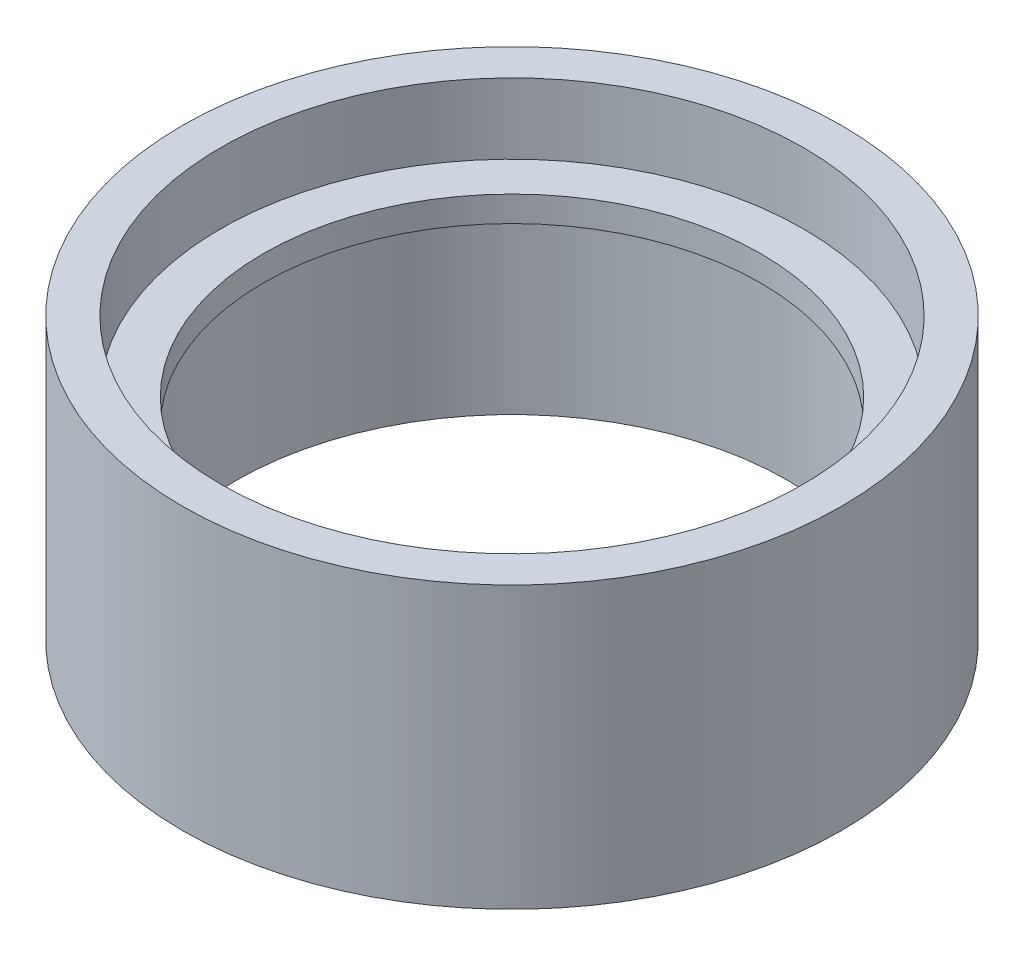
ISO-10303-21;
HEADER;
FILE_DESCRIPTION(('STEP AP214'),'2;1');
FILE_NAME('part.step','',(''),(''),'','','');
FILE_SCHEMA(('AUTOMOTIVE_DESIGN { 1 0 10303 214 1 1 1 1 }'));
ENDSEC;
DATA;
#1=APPLICATION_CONTEXT('core data for automotive mechanical design processes');
#2=APPLICATION_PROTOCOL_DEFINITION('international standard','automotive_design',2000,#1);
#3=PRODUCT_CONTEXT('',#1,'mechanical');
#4=PRODUCT('Part','Part','',(#3));
#5=PRODUCT_RELATED_PRODUCT_CATEGORY('part','',(#4));
#6=PRODUCT_DEFINITION_FORMATION('','',#4);
#7=PRODUCT_DEFINITION_CONTEXT('part definition',#1,'design');
#8=PRODUCT_DEFINITION('design','',#6,#7);
#9=PRODUCT_DEFINITION_SHAPE('','',#8);
#10=(LENGTH_UNIT() NAMED_UNIT(*) SI_UNIT(.MILLI.,.METRE.));
#11=(NAMED_UNIT(*) PLANE_ANGLE_UNIT() SI_UNIT($,.RADIAN.));
#12=(NAMED_UNIT(*) SI_UNIT($,.STERADIAN.) SOLID_ANGLE_UNIT());
#13=UNCERTAINTY_MEASURE_WITH_UNIT(LENGTH_MEASURE(1.E-05),#10,'distance_accuracy_value','');
#14=(GEOMETRIC_REPRESENTATION_CONTEXT(3) GLOBAL_UNCERTAINTY_ASSIGNED_CONTEXT((#13)) GLOBAL_UNIT_ASSIGNED_CONTEXT((#10,
#11,#12)) REPRESENTATION_CONTEXT('',''));
#15=CARTESIAN_POINT('',(0.,0.,0.));
#16=DIRECTION('',(0.,0.,1.));
#17=DIRECTION('',(1.,0.,0.));
#18=AXIS2_PLACEMENT_3D('',#15,#16,#17);
#19=CARTESIAN_POINT('',(0.,0.,0.));
#20=DIRECTION('',(0.,1.,0.));
#21=DIRECTION('',(0.,0.,1.));
#22=AXIS2_PLACEMENT_3D('',#19,#20,#21);
#23=PLANE('',#22);
#24=CARTESIAN_POINT('',(0.,0.,0.));
#25=DIRECTION('',(0.,1.,0.));
#26=DIRECTION('',(0.,0.,1.));
#27=AXIS2_PLACEMENT_3D('',#24,#25,#26);
#28=CIRCLE('',#27,24.765);
#29=CARTESIAN_POINT('',(0.,0.,24.765));
#30=VERTEX_POINT('',#29);
#31=EDGE_CURVE('E48',#30,#30,#28,.T.);
#32=ORIENTED_EDGE('',*,*,#31,.T.);
#33=EDGE_LOOP('',(#32));
#34=FACE_BOUND('',#33,.T.);
#35=CARTESIAN_POINT('',(0.,0.,0.));
#36=DIRECTION('',(0.,-1.,0.));
#37=DIRECTION('',(0.,0.,-1.));
#38=AXIS2_PLACEMENT_3D('',#35,#36,#37);
#39=CIRCLE('',#38,27.5082);
#40=CARTESIAN_POINT('',(0.,0.,-27.5082));
#41=VERTEX_POINT('',#40);
#42=EDGE_CURVE('E75',#41,#41,#39,.T.);
#43=ORIENTED_EDGE('',*,*,#42,.T.);
#44=EDGE_LOOP('',(#43));
#45=FACE_BOUND('',#44,.T.);
#46=ADVANCED_FACE('F45',(#34,#45),#23,.F.);
#47=CARTESIAN_POINT('',(0.,2.54,0.));
#48=DIRECTION('',(0.,1.,0.));
#49=DIRECTION('',(0.,0.,1.));
#50=AXIS2_PLACEMENT_3D('',#47,#48,#49);
#51=PLANE('',#50);
#52=CARTESIAN_POINT('',(0.,2.54,0.));
#53=DIRECTION('',(0.,1.,0.));
#54=DIRECTION('',(0.,0.,1.));
#55=AXIS2_PLACEMENT_3D('',#52,#53,#54);
#56=CIRCLE('',#55,29.0195);
#57=CARTESIAN_POINT('',(0.,2.53999999999999,-29.0195));
#58=VERTEX_POINT('',#57);
#59=EDGE_CURVE('E57',#58,#58,#56,.F.);
#60=ORIENTED_EDGE('',*,*,#59,.F.);
#61=EDGE_LOOP('',(#60));
#62=FACE_BOUND('',#61,.T.);
#63=CARTESIAN_POINT('',(0.,2.54,0.));
#64=DIRECTION('',(0.,1.,0.));
#65=DIRECTION('',(0.,0.,1.));
#66=AXIS2_PLACEMENT_3D('',#63,#64,#65);
#67=CIRCLE('',#66,24.765);
#68=CARTESIAN_POINT('',(0.,2.54,24.765));
#69=VERTEX_POINT('',#68);
#70=EDGE_CURVE('E11',#69,#69,#67,.T.);
#71=ORIENTED_EDGE('',*,*,#70,.F.);
#72=EDGE_LOOP('',(#71));
#73=FACE_BOUND('',#72,.T.);
#74=ADVANCED_FACE('F101',(#62,#73),#51,.T.);
#75=CARTESIAN_POINT('',(0.,2.54,0.));
#76=DIRECTION('',(0.,-1.,0.));
#77=DIRECTION('',(0.,0.,-1.));
#78=AXIS2_PLACEMENT_3D('',#75,#76,#77);
#79=CYLINDRICAL_SURFACE('',#78,24.765);
#80=ORIENTED_EDGE('',*,*,#70,.T.);
#81=EDGE_LOOP('',(#80));
#82=FACE_BOUND('',#81,.T.);
#83=ORIENTED_EDGE('',*,*,#31,.F.);
#84=EDGE_LOOP('',(#83));
#85=FACE_BOUND('',#84,.T.);
#86=ADVANCED_FACE('F106',(#82,#85),#79,.F.);
#87=CARTESIAN_POINT('',(0.,109.416648291855,0.));
#88=DIRECTION('',(0.,-1.,0.));
#89=DIRECTION('',(0.,0.,-1.));
#90=AXIS2_PLACEMENT_3D('',#87,#88,#89);
#91=CYLINDRICAL_SURFACE('',#90,32.8295);
#92=CARTESIAN_POINT('',(0.,9.5504,0.));
#93=DIRECTION('',(0.,1.,0.));
#94=DIRECTION('',(0.,0.,1.));
#95=AXIS2_PLACEMENT_3D('',#92,#93,#94);
#96=CIRCLE('',#95,32.8295);
#97=CARTESIAN_POINT('',(0.,9.55039999999999,-32.8295));
#98=VERTEX_POINT('',#97);
#99=EDGE_CURVE('E62',#98,#98,#96,.T.);
#100=CARTESIAN_POINT('',(0.,-18.415,0.));
#101=DIRECTION('',(0.,-1.,0.));
#102=DIRECTION('',(0.,0.,-1.));
#103=AXIS2_PLACEMENT_3D('',#100,#101,#102);
#104=CIRCLE('',#103,32.8295);
#105=CARTESIAN_POINT('',(0.,-18.415,-32.8295));
#106=VERTEX_POINT('',#105);
#107=EDGE_CURVE('E67',#106,#106,#104,.T.);
#108=CARTESIAN_POINT('',(0.,9.55039999999999,-32.8295));
#109=CARTESIAN_POINT('',(0.,9.25909374999999,-32.8295));
#110=CARTESIAN_POINT('',(0.,8.96778749999999,-32.8295));
#111=CARTESIAN_POINT('',(0.,8.38517499999999,-32.8295));
#112=CARTESIAN_POINT('',(0.,8.09386874999999,-32.8295));
#113=CARTESIAN_POINT('',(0.,7.51125624999999,-32.8295));
#114=CARTESIAN_POINT('',(0.,7.21994999999999,-32.8295));
#115=CARTESIAN_POINT('',(0.,6.63733749999999,-32.8295));
#116=CARTESIAN_POINT('',(0.,6.34603124999999,-32.8295));
#117=CARTESIAN_POINT('',(0.,5.76341874999999,-32.8295));
#118=CARTESIAN_POINT('',(0.,5.47211249999999,-32.8295));
#119=CARTESIAN_POINT('',(0.,4.88949999999999,-32.8295));
#120=CARTESIAN_POINT('',(0.,4.59819374999998,-32.8295));
#121=CARTESIAN_POINT('',(0.,4.01558124999998,-32.8295));
#122=CARTESIAN_POINT('',(0.,3.72427499999999,-32.8295));
#123=CARTESIAN_POINT('',(0.,3.14166249999998,-32.8295));
#124=CARTESIAN_POINT('',(0.,2.85035624999998,-32.8295));
#125=CARTESIAN_POINT('',(0.,2.26774374999998,-32.8295));
#126=CARTESIAN_POINT('',(0.,1.97643749999998,-32.8295));
#127=CARTESIAN_POINT('',(0.,1.39382499999999,-32.8295));
#128=CARTESIAN_POINT('',(0.,1.10251874999999,-32.8295));
#129=CARTESIAN_POINT('',(0.,0.519906249999989,-32.8295));
#130=CARTESIAN_POINT('',(0.,0.228599999999986,-32.8295));
#131=CARTESIAN_POINT('',(0.,-0.354012500000014,-32.8295));
#132=CARTESIAN_POINT('',(0.,-0.645318750000012,-32.8295));
#133=CARTESIAN_POINT('',(0.,-1.22793125000001,-32.8295));
#134=CARTESIAN_POINT('',(0.,-1.51923750000002,-32.8295));
#135=CARTESIAN_POINT('',(0.,-2.10185000000002,-32.8295));
#136=CARTESIAN_POINT('',(0.,-2.39315625000001,-32.8295));
#137=CARTESIAN_POINT('',(0.,-2.97576875000001,-32.8295));
#138=CARTESIAN_POINT('',(0.,-3.26707500000002,-32.8295));
#139=CARTESIAN_POINT('',(0.,-3.84968750000002,-32.8295));
#140=CARTESIAN_POINT('',(0.,-4.14099375000002,-32.8295));
#141=CARTESIAN_POINT('',(0.,-4.72360625000001,-32.8295));
#142=CARTESIAN_POINT('',(0.,-5.01491250000001,-32.8295));
#143=CARTESIAN_POINT('',(0.,-5.59752500000001,-32.8295));
#144=CARTESIAN_POINT('',(0.,-5.88883125000001,-32.8295));
#145=CARTESIAN_POINT('',(0.,-6.47144375000001,-32.8295));
#146=CARTESIAN_POINT('',(0.,-6.76275000000001,-32.8295));
#147=CARTESIAN_POINT('',(0.,-7.34536250000001,-32.8295));
#148=CARTESIAN_POINT('',(0.,-7.63666875000002,-32.8295));
#149=CARTESIAN_POINT('',(0.,-8.21928125000002,-32.8295));
#150=CARTESIAN_POINT('',(0.,-8.51058750000001,-32.8295));
#151=CARTESIAN_POINT('',(0.,-9.09320000000002,-32.8295));
#152=CARTESIAN_POINT('',(0.,-9.38450625000002,-32.8295));
#153=CARTESIAN_POINT('',(0.,-9.96711875000002,-32.8295));
#154=CARTESIAN_POINT('',(0.,-10.258425,-32.8295));
#155=CARTESIAN_POINT('',(0.,-10.8410375,-32.8295));
#156=CARTESIAN_POINT('',(0.,-11.13234375,-32.8295));
#157=CARTESIAN_POINT('',(0.,-11.71495625,-32.8295));
#158=CARTESIAN_POINT('',(0.,-12.0062625,-32.8295));
#159=CARTESIAN_POINT('',(0.,-12.588875,-32.8295));
#160=CARTESIAN_POINT('',(0.,-12.88018125,-32.8295));
#161=CARTESIAN_POINT('',(0.,-13.46279375,-32.8295));
#162=CARTESIAN_POINT('',(0.,-13.7541,-32.8295));
#163=CARTESIAN_POINT('',(0.,-14.3367125,-32.8295));
#164=CARTESIAN_POINT('',(0.,-14.62801875,-32.8295));
#165=CARTESIAN_POINT('',(0.,-15.21063125,-32.8295));
#166=CARTESIAN_POINT('',(0.,-15.5019375,-32.8295));
#167=CARTESIAN_POINT('',(0.,-16.08455,-32.8295));
#168=CARTESIAN_POINT('',(0.,-16.37585625,-32.8295));
#169=CARTESIAN_POINT('',(0.,-16.95846875,-32.8295));
#170=CARTESIAN_POINT('',(0.,-17.249775,-32.8295));
#171=CARTESIAN_POINT('',(0.,-17.8323875,-32.8295));
#172=CARTESIAN_POINT('',(0.,-18.12369375,-32.8295));
#173=CARTESIAN_POINT('',(0.,-18.415,-32.8295));
#174=B_SPLINE_CURVE_WITH_KNOTS('',3,(#108,#109,#110,#111,#112,#113,#114,#115,#116,#117,#118,
#119,#120,#121,#122,#123,#124,#125,#126,#127,#128,#129,#130,#131,#132,#133,#134,#135,#136,#137,
#138,#139,#140,#141,#142,#143,#144,#145,#146,#147,#148,#149,#150,#151,#152,#153,#154,#155,#156,
#157,#158,#159,#160,#161,#162,#163,#164,#165,#166,#167,#168,#169,#170,#171,#172,#173),
.UNSPECIFIED.,.F.,.F.,(4,2,2,2,2,2,2,2,2,2,2,2,2,2,2,2,2,2,2,2,2,2,2,2,2,2,2,2,2,2,2,2,4),(0.,
0.873918749999994,1.7478375,2.62175625,3.495675,4.36959375,5.24351250000001,6.11743125,
6.99135000000001,7.86526875,8.73918749999999,9.61310625,10.487025,11.36094375,12.2348625,
13.10878125,13.9827,14.85661875,15.7305375,16.60445625,17.478375,18.35229375,19.2262125,
20.10013125,20.97405,21.84796875,22.7218875,23.59580625,24.469725,25.34364375,26.2175625,
27.09148125,27.9654),.UNSPECIFIED.);
#175=EDGE_CURVE('BSEAM113',#98,#106,#174,.T.);
#176=ORIENTED_EDGE('',*,*,#99,.F.);
#177=ORIENTED_EDGE('',*,*,#107,.F.);
#178=ORIENTED_EDGE('',*,*,#175,.T.);
#179=ORIENTED_EDGE('',*,*,#175,.F.);
#180=EDGE_LOOP('',(#176,#178,#177,#179));
#181=FACE_BOUND('',#180,.T.);
#182=ADVANCED_FACE('F113',(#181),#91,.T.);
#183=CARTESIAN_POINT('',(0.,109.416648291855,0.));
#184=DIRECTION('',(0.,-1.,0.));
#185=DIRECTION('',(0.,0.,-1.));
#186=AXIS2_PLACEMENT_3D('',#183,#184,#185);
#187=CYLINDRICAL_SURFACE('',#186,29.0195);
#188=CARTESIAN_POINT('',(0.,9.5504,0.));
#189=DIRECTION('',(0.,1.,0.));
#190=DIRECTION('',(0.,0.,1.));
#191=AXIS2_PLACEMENT_3D('',#188,#189,#190);
#192=CIRCLE('',#191,29.0195);
#193=CARTESIAN_POINT('',(0.,9.55039999999999,-29.0195));
#194=VERTEX_POINT('',#193);
#195=EDGE_CURVE('E63',#194,#194,#192,.T.);
#196=CARTESIAN_POINT('',(0.,2.53999999999999,-29.0195));
#197=CARTESIAN_POINT('',(0.,2.61302499999999,-29.0195));
#198=CARTESIAN_POINT('',(0.,2.68604999999999,-29.0195));
#199=CARTESIAN_POINT('',(0.,2.83209999999999,-29.0195));
#200=CARTESIAN_POINT('',(0.,2.90512499999999,-29.0195));
#201=CARTESIAN_POINT('',(0.,3.05117499999998,-29.0195));
#202=CARTESIAN_POINT('',(0.,3.12419999999998,-29.0195));
#203=CARTESIAN_POINT('',(0.,3.27024999999998,-29.0195));
#204=CARTESIAN_POINT('',(0.,3.34327499999998,-29.0195));
#205=CARTESIAN_POINT('',(0.,3.48932499999998,-29.0195));
#206=CARTESIAN_POINT('',(0.,3.56234999999998,-29.0195));
#207=CARTESIAN_POINT('',(0.,3.70839999999998,-29.0195));
#208=CARTESIAN_POINT('',(0.,3.78142499999998,-29.0195));
#209=CARTESIAN_POINT('',(0.,3.92747499999998,-29.0195));
#210=CARTESIAN_POINT('',(0.,4.00049999999998,-29.0195));
#211=CARTESIAN_POINT('',(0.,4.14654999999998,-29.0195));
#212=CARTESIAN_POINT('',(0.,4.21957499999998,-29.0195));
#213=CARTESIAN_POINT('',(0.,4.36562499999998,-29.0195));
#214=CARTESIAN_POINT('',(0.,4.43864999999999,-29.0195));
#215=CARTESIAN_POINT('',(0.,4.58469999999999,-29.0195));
#216=CARTESIAN_POINT('',(0.,4.65772499999999,-29.0195));
#217=CARTESIAN_POINT('',(0.,4.80377499999999,-29.0195));
#218=CARTESIAN_POINT('',(0.,4.87679999999999,-29.0195));
#219=CARTESIAN_POINT('',(0.,5.02284999999999,-29.0195));
#220=CARTESIAN_POINT('',(0.,5.09587499999999,-29.0195));
#221=CARTESIAN_POINT('',(0.,5.24192499999999,-29.0195));
#222=CARTESIAN_POINT('',(0.,5.31494999999999,-29.0195));
#223=CARTESIAN_POINT('',(0.,5.46099999999999,-29.0195));
#224=CARTESIAN_POINT('',(0.,5.53402499999999,-29.0195));
#225=CARTESIAN_POINT('',(0.,5.68007499999999,-29.0195));
#226=CARTESIAN_POINT('',(0.,5.75309999999999,-29.0195));
#227=CARTESIAN_POINT('',(0.,5.89914999999999,-29.0195));
#228=CARTESIAN_POINT('',(0.,5.97217499999999,-29.0195));
#229=CARTESIAN_POINT('',(0.,6.11822499999999,-29.0195));
#230=CARTESIAN_POINT('',(0.,6.19124999999999,-29.0195));
#231=CARTESIAN_POINT('',(0.,6.33729999999999,-29.0195));
#232=CARTESIAN_POINT('',(0.,6.41032499999999,-29.0195));
#233=CARTESIAN_POINT('',(0.,6.55637499999998,-29.0195));
#234=CARTESIAN_POINT('',(0.,6.62939999999998,-29.0195));
#235=CARTESIAN_POINT('',(0.,6.77544999999998,-29.0195));
#236=CARTESIAN_POINT('',(0.,6.84847499999998,-29.0195));
#237=CARTESIAN_POINT('',(0.,6.99452499999998,-29.0195));
#238=CARTESIAN_POINT('',(0.,7.06754999999998,-29.0195));
#239=CARTESIAN_POINT('',(0.,7.21359999999998,-29.0195));
#240=CARTESIAN_POINT('',(0.,7.28662499999998,-29.0195));
#241=CARTESIAN_POINT('',(0.,7.43267499999998,-29.0195));
#242=CARTESIAN_POINT('',(0.,7.50569999999998,-29.0195));
#243=CARTESIAN_POINT('',(0.,7.65174999999998,-29.0195));
#244=CARTESIAN_POINT('',(0.,7.72477499999999,-29.0195));
#245=CARTESIAN_POINT('',(0.,7.87082499999999,-29.0195));
#246=CARTESIAN_POINT('',(0.,7.94384999999999,-29.0195));
#247=CARTESIAN_POINT('',(0.,8.08989999999999,-29.0195));
#248=CARTESIAN_POINT('',(0.,8.16292499999999,-29.0195));
#249=CARTESIAN_POINT('',(0.,8.30897499999999,-29.0195));
#250=CARTESIAN_POINT('',(0.,8.38199999999999,-29.0195));
#251=CARTESIAN_POINT('',(0.,8.52804999999999,-29.0195));
#252=CARTESIAN_POINT('',(0.,8.60107499999999,-29.0195));
#253=CARTESIAN_POINT('',(0.,8.74712499999999,-29.0195));
#254=CARTESIAN_POINT('',(0.,8.82014999999999,-29.0195));
#255=CARTESIAN_POINT('',(0.,8.96619999999999,-29.0195));
#256=CARTESIAN_POINT('',(0.,9.03922499999999,-29.0195));
#257=CARTESIAN_POINT('',(0.,9.18527499999999,-29.0195));
#258=CARTESIAN_POINT('',(0.,9.25829999999999,-29.0195));
#259=CARTESIAN_POINT('',(0.,9.40434999999999,-29.0195));
#260=CARTESIAN_POINT('',(0.,9.47737499999999,-29.0195));
#261=CARTESIAN_POINT('',(0.,9.55039999999999,-29.0195));
#262=B_SPLINE_CURVE_WITH_KNOTS('',3,(#196,#197,#198,#199,#200,#201,#202,#203,#204,#205,#206,
#207,#208,#209,#210,#211,#212,#213,#214,#215,#216,#217,#218,#219,#220,#221,#222,#223,#224,#225,
#226,#227,#228,#229,#230,#231,#232,#233,#234,#235,#236,#237,#238,#239,#240,#241,#242,#243,#244,
#245,#246,#247,#248,#249,#250,#251,#252,#253,#254,#255,#256,#257,#258,#259,#260,#261),
.UNSPECIFIED.,.F.,.F.,(4,2,2,2,2,2,2,2,2,2,2,2,2,2,2,2,2,2,2,2,2,2,2,2,2,2,2,2,2,2,2,2,4),(0.,
0.219074999999999,0.438149999999998,0.657224999999997,0.876299999999997,1.095375,
1.31444999999999,1.53352499999999,1.75259999999999,1.97167500000001,2.19075000000001,2.409825,
2.6289,2.847975,3.06705,3.286125,3.5052,3.724275,3.94335,4.162425,4.3815,4.600575,
4.81964999999999,5.03872499999999,5.25780000000001,5.47687500000001,5.69595000000001,5.915025,
6.1341,6.353175,6.57225,6.791325,7.0104),.UNSPECIFIED.);
#263=EDGE_CURVE('BSEAM97',#58,#194,#262,.T.);
#264=ORIENTED_EDGE('',*,*,#59,.T.);
#265=ORIENTED_EDGE('',*,*,#195,.T.);
#266=ORIENTED_EDGE('',*,*,#263,.T.);
#267=ORIENTED_EDGE('',*,*,#263,.F.);
#268=EDGE_LOOP('',(#264,#266,#265,#267));
#269=FACE_BOUND('',#268,.T.);
#270=ADVANCED_FACE('F97',(#269),#187,.F.);
#271=CARTESIAN_POINT('',(0.,9.5504,0.));
#272=DIRECTION('',(0.,1.,0.));
#273=DIRECTION('',(0.,0.,1.));
#274=AXIS2_PLACEMENT_3D('',#271,#272,#273);
#275=PLANE('',#274);
#276=ORIENTED_EDGE('',*,*,#195,.F.);
#277=EDGE_LOOP('',(#276));
#278=FACE_BOUND('',#277,.T.);
#279=ORIENTED_EDGE('',*,*,#99,.T.);
#280=EDGE_LOOP('',(#279));
#281=FACE_BOUND('',#280,.T.);
#282=ADVANCED_FACE('F88',(#278,#281),#275,.T.);
#283=CARTESIAN_POINT('',(0.,-18.415,0.));
#284=DIRECTION('',(0.,-1.,0.));
#285=DIRECTION('',(0.,0.,-1.));
#286=AXIS2_PLACEMENT_3D('',#283,#284,#285);
#287=PLANE('',#286);
#288=ORIENTED_EDGE('',*,*,#107,.T.);
#289=EDGE_LOOP('',(#288));
#290=FACE_BOUND('',#289,.T.);
#291=CARTESIAN_POINT('',(0.,-18.415,0.));
#292=DIRECTION('',(0.,-1.,0.));
#293=DIRECTION('',(0.,0.,-1.));
#294=AXIS2_PLACEMENT_3D('',#291,#292,#293);
#295=CIRCLE('',#294,27.5082);
#296=CARTESIAN_POINT('',(0.,-18.415,-27.5082));
#297=VERTEX_POINT('',#296);
#298=EDGE_CURVE('E74',#297,#297,#295,.T.);
#299=ORIENTED_EDGE('',*,*,#298,.F.);
#300=EDGE_LOOP('',(#299));
#301=FACE_BOUND('',#300,.T.);
#302=ADVANCED_FACE('F86',(#290,#301),#287,.T.);
#303=CARTESIAN_POINT('',(0.,-18.415,0.));
#304=DIRECTION('',(0.,1.,0.));
#305=DIRECTION('',(0.,0.,1.));
#306=AXIS2_PLACEMENT_3D('',#303,#304,#305);
#307=CYLINDRICAL_SURFACE('',#306,27.5082);
#308=ORIENTED_EDGE('',*,*,#298,.T.);
#309=EDGE_LOOP('',(#308));
#310=FACE_BOUND('',#309,.T.);
#311=ORIENTED_EDGE('',*,*,#42,.F.);
#312=EDGE_LOOP('',(#311));
#313=FACE_BOUND('',#312,.T.);
#314=ADVANCED_FACE('F83',(#310,#313),#307,.F.);
#315=CLOSED_SHELL('',(#46,#74,#86,#182,#270,#282,#302,#314));
#316=MANIFOLD_SOLID_BREP('B2',#315);
#317=ADVANCED_BREP_SHAPE_REPRESENTATION('',(#18,#316),#14);
#318=SHAPE_DEFINITION_REPRESENTATION(#9,#317);
ENDSEC;
END-ISO-10303-21;
